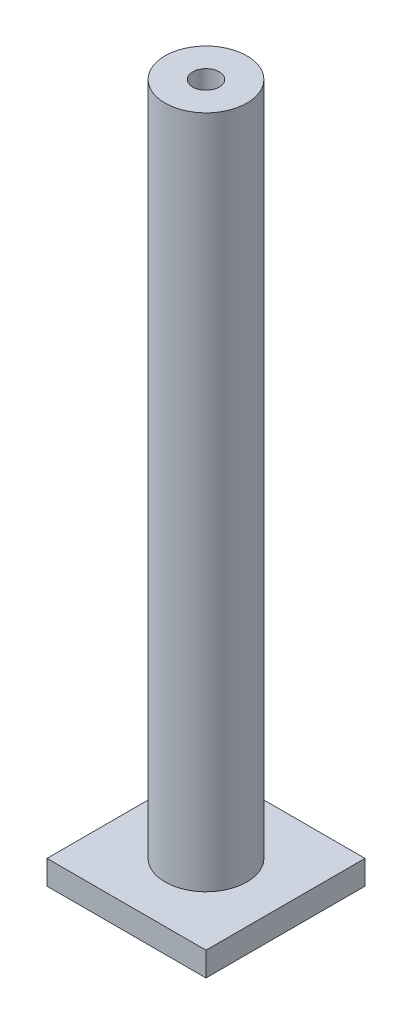
ISO-10303-21;
HEADER;
FILE_DESCRIPTION(('STEP AP214'),'2;1');
FILE_NAME('part.step','',(''),(''),'','','');
FILE_SCHEMA(('AUTOMOTIVE_DESIGN { 1 0 10303 214 1 1 1 1 }'));
ENDSEC;
DATA;
#1=APPLICATION_CONTEXT('core data for automotive mechanical design processes');
#2=APPLICATION_PROTOCOL_DEFINITION('international standard','automotive_design',2000,#1);
#3=PRODUCT_CONTEXT('',#1,'mechanical');
#4=PRODUCT('Part','Part','',(#3));
#5=PRODUCT_RELATED_PRODUCT_CATEGORY('part','',(#4));
#6=PRODUCT_DEFINITION_FORMATION('','',#4);
#7=PRODUCT_DEFINITION_CONTEXT('part definition',#1,'design');
#8=PRODUCT_DEFINITION('design','',#6,#7);
#9=PRODUCT_DEFINITION_SHAPE('','',#8);
#10=(LENGTH_UNIT() NAMED_UNIT(*) SI_UNIT(.MILLI.,.METRE.));
#11=(NAMED_UNIT(*) PLANE_ANGLE_UNIT() SI_UNIT($,.RADIAN.));
#12=(NAMED_UNIT(*) SI_UNIT($,.STERADIAN.) SOLID_ANGLE_UNIT());
#13=UNCERTAINTY_MEASURE_WITH_UNIT(LENGTH_MEASURE(1.E-05),#10,'distance_accuracy_value','');
#14=(GEOMETRIC_REPRESENTATION_CONTEXT(3) GLOBAL_UNCERTAINTY_ASSIGNED_CONTEXT((#13)) GLOBAL_UNIT_ASSIGNED_CONTEXT((#10,
#11,#12)) REPRESENTATION_CONTEXT('',''));
#15=CARTESIAN_POINT('',(0.,0.,0.));
#16=DIRECTION('',(0.,0.,1.));
#17=DIRECTION('',(1.,0.,0.));
#18=AXIS2_PLACEMENT_3D('',#15,#16,#17);
#19=CARTESIAN_POINT('',(0.,2.5,0.));
#20=DIRECTION('',(0.,1.,0.));
#21=DIRECTION('',(0.,0.,1.));
#22=AXIS2_PLACEMENT_3D('',#19,#20,#21);
#23=PLANE('',#22);
#24=DIRECTION('',(0.,0.,1.));
#25=VECTOR('',#24,1.);
#26=CARTESIAN_POINT('',(-7.79447852760735,2.5,-6.83282208588957));
#27=LINE('',#26,#25);
#28=CARTESIAN_POINT('',(-7.79447852760735,2.5,-6.83282208588957));
#29=VERTEX_POINT('',#28);
#30=CARTESIAN_POINT('',(-7.79447852760735,2.5,9.66717791411043));
#31=VERTEX_POINT('',#30);
#32=EDGE_CURVE('E87',#29,#31,#27,.T.);
#33=ORIENTED_EDGE('',*,*,#32,.T.);
#34=DIRECTION('',(1.,0.,0.));
#35=VECTOR('',#34,1.);
#36=CARTESIAN_POINT('',(-7.79447852760735,2.5,9.66717791411043));
#37=LINE('',#36,#35);
#38=CARTESIAN_POINT('',(8.70552147239265,2.5,9.66717791411043));
#39=VERTEX_POINT('',#38);
#40=EDGE_CURVE('E82',#31,#39,#37,.T.);
#41=ORIENTED_EDGE('',*,*,#40,.T.);
#42=DIRECTION('',(0.,0.,-1.));
#43=VECTOR('',#42,1.);
#44=CARTESIAN_POINT('',(8.70552147239265,2.5,-6.83282208588958));
#45=LINE('',#44,#43);
#46=CARTESIAN_POINT('',(8.70552147239265,2.5,-6.83282208588958));
#47=VERTEX_POINT('',#46);
#48=EDGE_CURVE('E85',#39,#47,#45,.T.);
#49=ORIENTED_EDGE('',*,*,#48,.T.);
#50=DIRECTION('',(-1.,0.,0.));
#51=VECTOR('',#50,1.);
#52=CARTESIAN_POINT('',(-7.79447852760735,2.5,-6.83282208588957));
#53=LINE('',#52,#51);
#54=EDGE_CURVE('E52',#47,#29,#53,.T.);
#55=ORIENTED_EDGE('',*,*,#54,.T.);
#56=EDGE_LOOP('',(#33,#41,#49,#55));
#57=FACE_BOUND('',#56,.T.);
#58=CARTESIAN_POINT('',(0.455521472392649,2.5,1.41717791411042));
#59=DIRECTION('',(0.,1.,0.));
#60=DIRECTION('',(0.,0.,1.));
#61=AXIS2_PLACEMENT_3D('',#58,#59,#60);
#62=CIRCLE('',#61,4.25);
#63=CARTESIAN_POINT('',(0.455521472392649,2.5,5.66717791411043));
#64=VERTEX_POINT('',#63);
#65=EDGE_CURVE('E117',#64,#64,#62,.T.);
#66=ORIENTED_EDGE('',*,*,#65,.F.);
#67=EDGE_LOOP('',(#66));
#68=FACE_BOUND('',#67,.T.);
#69=ADVANCED_FACE('F35',(#57,#68),#23,.T.);
#70=CARTESIAN_POINT('',(0.,0.,0.));
#71=DIRECTION('',(0.,1.,0.));
#72=DIRECTION('',(0.,0.,1.));
#73=AXIS2_PLACEMENT_3D('',#70,#71,#72);
#74=PLANE('',#73);
#75=DIRECTION('',(0.,0.,1.));
#76=VECTOR('',#75,1.);
#77=CARTESIAN_POINT('',(-7.79447852760735,0.,-6.83282208588957));
#78=LINE('',#77,#76);
#79=CARTESIAN_POINT('',(-7.79447852760735,0.,-6.83282208588957));
#80=VERTEX_POINT('',#79);
#81=CARTESIAN_POINT('',(-7.79447852760735,0.,9.66717791411043));
#82=VERTEX_POINT('',#81);
#83=EDGE_CURVE('E99',#80,#82,#78,.T.);
#84=ORIENTED_EDGE('',*,*,#83,.F.);
#85=DIRECTION('',(-1.,0.,0.));
#86=VECTOR('',#85,1.);
#87=CARTESIAN_POINT('',(-7.79447852760735,0.,-6.83282208588957));
#88=LINE('',#87,#86);
#89=CARTESIAN_POINT('',(8.70552147239265,0.,-6.83282208588958));
#90=VERTEX_POINT('',#89);
#91=EDGE_CURVE('E75',#90,#80,#88,.T.);
#92=ORIENTED_EDGE('',*,*,#91,.F.);
#93=DIRECTION('',(0.,0.,-1.));
#94=VECTOR('',#93,1.);
#95=CARTESIAN_POINT('',(8.70552147239265,0.,-6.83282208588958));
#96=LINE('',#95,#94);
#97=CARTESIAN_POINT('',(8.70552147239265,0.,9.66717791411043));
#98=VERTEX_POINT('',#97);
#99=EDGE_CURVE('E69',#98,#90,#96,.T.);
#100=ORIENTED_EDGE('',*,*,#99,.F.);
#101=DIRECTION('',(1.,0.,0.));
#102=VECTOR('',#101,1.);
#103=CARTESIAN_POINT('',(-7.79447852760735,0.,9.66717791411043));
#104=LINE('',#103,#102);
#105=EDGE_CURVE('E91',#82,#98,#104,.T.);
#106=ORIENTED_EDGE('',*,*,#105,.F.);
#107=EDGE_LOOP('',(#84,#92,#100,#106));
#108=FACE_BOUND('',#107,.T.);
#109=CARTESIAN_POINT('',(0.455521472392649,0.,1.41717791411042));
#110=DIRECTION('',(0.,1.,0.));
#111=DIRECTION('',(0.,0.,1.));
#112=AXIS2_PLACEMENT_3D('',#109,#110,#111);
#113=CIRCLE('',#112,1.375);
#114=CARTESIAN_POINT('',(0.455521472392649,0.,2.79217791411042));
#115=VERTEX_POINT('',#114);
#116=EDGE_CURVE('E102',#115,#115,#113,.T.);
#117=ORIENTED_EDGE('',*,*,#116,.T.);
#118=EDGE_LOOP('',(#117));
#119=FACE_BOUND('',#118,.T.);
#120=ADVANCED_FACE('F110',(#108,#119),#74,.F.);
#121=CARTESIAN_POINT('',(-7.79447852760735,2.5,-6.83282208588957));
#122=DIRECTION('',(1.,0.,0.));
#123=DIRECTION('',(0.,0.,-1.));
#124=AXIS2_PLACEMENT_3D('',#121,#122,#123);
#125=PLANE('',#124);
#126=ORIENTED_EDGE('',*,*,#83,.T.);
#127=DIRECTION('',(0.,-1.,0.));
#128=VECTOR('',#127,1.);
#129=CARTESIAN_POINT('',(-7.79447852760735,2.5,9.66717791411043));
#130=LINE('',#129,#128);
#131=EDGE_CURVE('E11',#31,#82,#130,.T.);
#132=ORIENTED_EDGE('',*,*,#131,.F.);
#133=ORIENTED_EDGE('',*,*,#32,.F.);
#134=DIRECTION('',(0.,-1.,0.));
#135=VECTOR('',#134,1.);
#136=CARTESIAN_POINT('',(-7.79447852760735,2.5,-6.83282208588957));
#137=LINE('',#136,#135);
#138=EDGE_CURVE('E95',#29,#80,#137,.T.);
#139=ORIENTED_EDGE('',*,*,#138,.T.);
#140=EDGE_LOOP('',(#126,#132,#133,#139));
#141=FACE_BOUND('',#140,.T.);
#142=ADVANCED_FACE('F37',(#141),#125,.F.);
#143=CARTESIAN_POINT('',(-7.79447852760735,2.5,9.66717791411043));
#144=DIRECTION('',(0.,0.,-1.));
#145=DIRECTION('',(-1.,0.,0.));
#146=AXIS2_PLACEMENT_3D('',#143,#144,#145);
#147=PLANE('',#146);
#148=ORIENTED_EDGE('',*,*,#105,.T.);
#149=DIRECTION('',(0.,-1.,0.));
#150=VECTOR('',#149,1.);
#151=CARTESIAN_POINT('',(8.70552147239265,2.5,9.66717791411043));
#152=LINE('',#151,#150);
#153=EDGE_CURVE('E44',#39,#98,#152,.T.);
#154=ORIENTED_EDGE('',*,*,#153,.F.);
#155=ORIENTED_EDGE('',*,*,#40,.F.);
#156=ORIENTED_EDGE('',*,*,#131,.T.);
#157=EDGE_LOOP('',(#148,#154,#155,#156));
#158=FACE_BOUND('',#157,.T.);
#159=ADVANCED_FACE('F90',(#158),#147,.F.);
#160=CARTESIAN_POINT('',(8.70552147239265,2.5,-6.83282208588958));
#161=DIRECTION('',(-1.,0.,0.));
#162=DIRECTION('',(0.,0.,1.));
#163=AXIS2_PLACEMENT_3D('',#160,#161,#162);
#164=PLANE('',#163);
#165=ORIENTED_EDGE('',*,*,#99,.T.);
#166=DIRECTION('',(0.,-1.,0.));
#167=VECTOR('',#166,1.);
#168=CARTESIAN_POINT('',(8.70552147239265,2.5,-6.83282208588958));
#169=LINE('',#168,#167);
#170=EDGE_CURVE('E92',#47,#90,#169,.T.);
#171=ORIENTED_EDGE('',*,*,#170,.F.);
#172=ORIENTED_EDGE('',*,*,#48,.F.);
#173=ORIENTED_EDGE('',*,*,#153,.T.);
#174=EDGE_LOOP('',(#165,#171,#172,#173));
#175=FACE_BOUND('',#174,.T.);
#176=ADVANCED_FACE('F93',(#175),#164,.F.);
#177=CARTESIAN_POINT('',(-7.79447852760735,2.5,-6.83282208588957));
#178=DIRECTION('',(0.,0.,1.));
#179=DIRECTION('',(1.,0.,0.));
#180=AXIS2_PLACEMENT_3D('',#177,#178,#179);
#181=PLANE('',#180);
#182=ORIENTED_EDGE('',*,*,#91,.T.);
#183=ORIENTED_EDGE('',*,*,#138,.F.);
#184=ORIENTED_EDGE('',*,*,#54,.F.);
#185=ORIENTED_EDGE('',*,*,#170,.T.);
#186=EDGE_LOOP('',(#182,#183,#184,#185));
#187=FACE_BOUND('',#186,.T.);
#188=ADVANCED_FACE('F107',(#187),#181,.F.);
#189=CARTESIAN_POINT('',(0.455521472392649,2.5,1.41717791411042));
#190=DIRECTION('',(0.,-1.,0.));
#191=DIRECTION('',(0.,0.,-1.));
#192=AXIS2_PLACEMENT_3D('',#189,#190,#191);
#193=CYLINDRICAL_SURFACE('',#192,1.375);
#194=ORIENTED_EDGE('',*,*,#116,.F.);
#195=EDGE_LOOP('',(#194));
#196=FACE_BOUND('',#195,.T.);
#197=CARTESIAN_POINT('',(0.455521472392649,72.5,1.41717791411042));
#198=DIRECTION('',(0.,1.,0.));
#199=DIRECTION('',(0.,0.,1.));
#200=AXIS2_PLACEMENT_3D('',#197,#198,#199);
#201=CIRCLE('',#200,1.375);
#202=CARTESIAN_POINT('',(0.455521472392649,72.5,2.79217791411042));
#203=VERTEX_POINT('',#202);
#204=EDGE_CURVE('E120',#203,#203,#201,.T.);
#205=ORIENTED_EDGE('',*,*,#204,.T.);
#206=EDGE_LOOP('',(#205));
#207=FACE_BOUND('',#206,.T.);
#208=ADVANCED_FACE('F126',(#196,#207),#193,.F.);
#209=CARTESIAN_POINT('',(0.455521472392649,72.5,1.41717791411042));
#210=DIRECTION('',(0.,1.,0.));
#211=DIRECTION('',(0.,0.,1.));
#212=AXIS2_PLACEMENT_3D('',#209,#210,#211);
#213=PLANE('',#212);
#214=CARTESIAN_POINT('',(0.455521472392649,72.5,1.41717791411042));
#215=DIRECTION('',(0.,1.,0.));
#216=DIRECTION('',(0.,0.,1.));
#217=AXIS2_PLACEMENT_3D('',#214,#215,#216);
#218=CIRCLE('',#217,4.25);
#219=CARTESIAN_POINT('',(0.455521472392649,72.5,5.66717791411043));
#220=VERTEX_POINT('',#219);
#221=EDGE_CURVE('E116',#220,#220,#218,.T.);
#222=ORIENTED_EDGE('',*,*,#221,.T.);
#223=EDGE_LOOP('',(#222));
#224=FACE_BOUND('',#223,.T.);
#225=ORIENTED_EDGE('',*,*,#204,.F.);
#226=EDGE_LOOP('',(#225));
#227=FACE_BOUND('',#226,.T.);
#228=ADVANCED_FACE('F128',(#224,#227),#213,.T.);
#229=CARTESIAN_POINT('',(0.455521472392649,72.5,1.41717791411042));
#230=DIRECTION('',(0.,-1.,0.));
#231=DIRECTION('',(0.,0.,-1.));
#232=AXIS2_PLACEMENT_3D('',#229,#230,#231);
#233=CYLINDRICAL_SURFACE('',#232,4.25);
#234=ORIENTED_EDGE('',*,*,#221,.F.);
#235=EDGE_LOOP('',(#234));
#236=FACE_BOUND('',#235,.T.);
#237=ORIENTED_EDGE('',*,*,#65,.T.);
#238=EDGE_LOOP('',(#237));
#239=FACE_BOUND('',#238,.T.);
#240=ADVANCED_FACE('F130',(#236,#239),#233,.T.);
#241=CLOSED_SHELL('',(#69,#120,#142,#159,#176,#188,#208,#228,#240));
#242=MANIFOLD_SOLID_BREP('B2',#241);
#243=ADVANCED_BREP_SHAPE_REPRESENTATION('',(#18,#242),#14);
#244=SHAPE_DEFINITION_REPRESENTATION(#9,#243);
ENDSEC;
END-ISO-10303-21;
